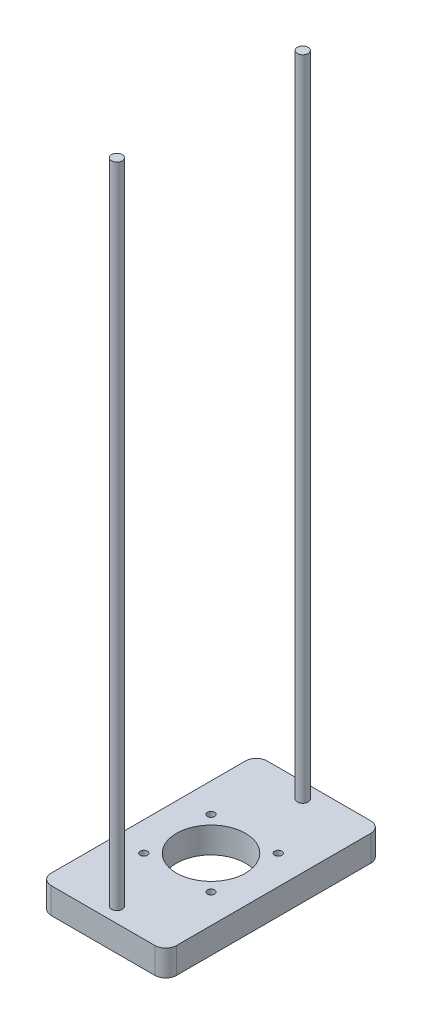
ISO-10303-21;
HEADER;
FILE_DESCRIPTION(('STEP AP214'),'2;1');
FILE_NAME('part.step','',(''),(''),'','','');
FILE_SCHEMA(('AUTOMOTIVE_DESIGN { 1 0 10303 214 1 1 1 1 }'));
ENDSEC;
DATA;
#1=APPLICATION_CONTEXT('core data for automotive mechanical design processes');
#2=APPLICATION_PROTOCOL_DEFINITION('international standard','automotive_design',2000,#1);
#3=PRODUCT_CONTEXT('',#1,'mechanical');
#4=PRODUCT('Part','Part','',(#3));
#5=PRODUCT_RELATED_PRODUCT_CATEGORY('part','',(#4));
#6=PRODUCT_DEFINITION_FORMATION('','',#4);
#7=PRODUCT_DEFINITION_CONTEXT('part definition',#1,'design');
#8=PRODUCT_DEFINITION('design','',#6,#7);
#9=PRODUCT_DEFINITION_SHAPE('','',#8);
#10=(LENGTH_UNIT() NAMED_UNIT(*) SI_UNIT(.MILLI.,.METRE.));
#11=(NAMED_UNIT(*) PLANE_ANGLE_UNIT() SI_UNIT($,.RADIAN.));
#12=(NAMED_UNIT(*) SI_UNIT($,.STERADIAN.) SOLID_ANGLE_UNIT());
#13=UNCERTAINTY_MEASURE_WITH_UNIT(LENGTH_MEASURE(1.E-05),#10,'distance_accuracy_value','');
#14=(GEOMETRIC_REPRESENTATION_CONTEXT(3) GLOBAL_UNCERTAINTY_ASSIGNED_CONTEXT((#13)) GLOBAL_UNIT_ASSIGNED_CONTEXT((#10,
#11,#12)) REPRESENTATION_CONTEXT('',''));
#15=CARTESIAN_POINT('',(0.,0.,0.));
#16=DIRECTION('',(0.,0.,1.));
#17=DIRECTION('',(1.,0.,0.));
#18=AXIS2_PLACEMENT_3D('',#15,#16,#17);
#19=CARTESIAN_POINT('',(29.246062992126,21.,-61.3135876064418));
#20=DIRECTION('',(0.,-1.,0.));
#21=DIRECTION('',(0.,0.,-1.));
#22=AXIS2_PLACEMENT_3D('',#19,#20,#21);
#23=PLANE('',#22);
#24=CARTESIAN_POINT('',(4.7046178470314,21.,26.6530870575681));
#25=DIRECTION('',(0.,-1.,0.));
#26=DIRECTION('',(0.,0.,-1.));
#27=AXIS2_PLACEMENT_3D('',#24,#25,#26);
#28=CIRCLE('',#27,2.5);
#29=CARTESIAN_POINT('',(4.7046178470314,21.,24.1530870575681));
#30=VERTEX_POINT('',#29);
#31=EDGE_CURVE('E11',#30,#30,#28,.F.);
#32=ORIENTED_EDGE('',*,*,#31,.F.);
#33=EDGE_LOOP('',(#32));
#34=FACE_BOUND('',#33,.T.);
#35=CARTESIAN_POINT('',(4.69617178425094,21.,-59.3399877427739));
#36=DIRECTION('',(0.,-1.,0.));
#37=DIRECTION('',(0.,0.,-1.));
#38=AXIS2_PLACEMENT_3D('',#35,#36,#37);
#39=CIRCLE('',#38,2.5);
#40=CARTESIAN_POINT('',(4.69617178425094,21.,-61.8399877427739));
#41=VERTEX_POINT('',#40);
#42=EDGE_CURVE('E45',#41,#41,#39,.F.);
#43=ORIENTED_EDGE('',*,*,#42,.F.);
#44=EDGE_LOOP('',(#43));
#45=FACE_BOUND('',#44,.T.);
#46=CARTESIAN_POINT('',(-10.3102861939768,21.,-0.78715475090257));
#47=DIRECTION('',(0.,1.,0.));
#48=DIRECTION('',(0.,0.,1.));
#49=AXIS2_PLACEMENT_3D('',#46,#47,#48);
#50=CIRCLE('',#49,1.7);
#51=CARTESIAN_POINT('',(-10.3102861939768,21.,0.912845249097429));
#52=VERTEX_POINT('',#51);
#53=EDGE_CURVE('E168',#52,#52,#50,.T.);
#54=ORIENTED_EDGE('',*,*,#53,.F.);
#55=EDGE_LOOP('',(#54));
#56=FACE_BOUND('',#55,.T.);
#57=CARTESIAN_POINT('',(-10.3102861939768,21.,-31.8998531231132));
#58=DIRECTION('',(0.,1.,0.));
#59=DIRECTION('',(0.,0.,1.));
#60=AXIS2_PLACEMENT_3D('',#57,#58,#59);
#61=CIRCLE('',#60,1.7);
#62=CARTESIAN_POINT('',(-10.3102861939768,21.,-30.1998531231132));
#63=VERTEX_POINT('',#62);
#64=EDGE_CURVE('E193',#63,#63,#61,.T.);
#65=ORIENTED_EDGE('',*,*,#64,.F.);
#66=EDGE_LOOP('',(#65));
#67=FACE_BOUND('',#66,.T.);
#68=CARTESIAN_POINT('',(20.8024121782313,21.,-31.8998531231106));
#69=DIRECTION('',(0.,1.,0.));
#70=DIRECTION('',(0.,0.,1.));
#71=AXIS2_PLACEMENT_3D('',#68,#69,#70);
#72=CIRCLE('',#71,1.7);
#73=CARTESIAN_POINT('',(20.8024121782313,21.,-30.1998531231106));
#74=VERTEX_POINT('',#73);
#75=EDGE_CURVE('E197',#74,#74,#72,.T.);
#76=ORIENTED_EDGE('',*,*,#75,.F.);
#77=EDGE_LOOP('',(#76));
#78=FACE_BOUND('',#77,.T.);
#79=CARTESIAN_POINT('',(20.8024121782313,21.,-0.787154750905122));
#80=DIRECTION('',(0.,1.,0.));
#81=DIRECTION('',(0.,0.,1.));
#82=AXIS2_PLACEMENT_3D('',#79,#80,#81);
#83=CIRCLE('',#82,1.7);
#84=CARTESIAN_POINT('',(20.8024121782313,21.,0.912845249094878));
#85=VERTEX_POINT('',#84);
#86=EDGE_CURVE('E200',#85,#85,#83,.T.);
#87=ORIENTED_EDGE('',*,*,#86,.F.);
#88=EDGE_LOOP('',(#87));
#89=FACE_BOUND('',#88,.T.);
#90=CARTESIAN_POINT('',(29.246062992126,21.,-61.3135876064418));
#91=DIRECTION('',(0.,1.,0.));
#92=DIRECTION('',(0.,0.,-1.));
#93=AXIS2_PLACEMENT_3D('',#90,#91,#92);
#94=CIRCLE('',#93,5.);
#95=CARTESIAN_POINT('',(34.246062992126,21.,-61.3135876064418));
#96=VERTEX_POINT('',#95);
#97=CARTESIAN_POINT('',(29.2460629921259,21.,-66.3135876064418));
#98=VERTEX_POINT('',#97);
#99=EDGE_CURVE('E149',#96,#98,#94,.T.);
#100=ORIENTED_EDGE('',*,*,#99,.T.);
#101=DIRECTION('',(-1.,0.,0.));
#102=VECTOR('',#101,1.);
#103=CARTESIAN_POINT('',(-18.753937007874,21.,-66.3135876064418));
#104=LINE('',#103,#102);
#105=CARTESIAN_POINT('',(-18.753937007874,21.,-66.3135876064418));
#106=VERTEX_POINT('',#105);
#107=EDGE_CURVE('E97',#98,#106,#104,.T.);
#108=ORIENTED_EDGE('',*,*,#107,.T.);
#109=CARTESIAN_POINT('',(-18.753937007874,21.,-61.3135876064418));
#110=DIRECTION('',(0.,1.,0.));
#111=DIRECTION('',(0.,0.,-1.));
#112=AXIS2_PLACEMENT_3D('',#109,#110,#111);
#113=CIRCLE('',#112,5.);
#114=CARTESIAN_POINT('',(-23.753937007874,21.,-61.3135876064418));
#115=VERTEX_POINT('',#114);
#116=EDGE_CURVE('E216',#106,#115,#113,.T.);
#117=ORIENTED_EDGE('',*,*,#116,.T.);
#118=DIRECTION('',(0.,0.,1.));
#119=VECTOR('',#118,1.);
#120=CARTESIAN_POINT('',(-23.753937007874,21.,28.626579732426));
#121=LINE('',#120,#119);
#122=CARTESIAN_POINT('',(-23.753937007874,21.,28.626579732426));
#123=VERTEX_POINT('',#122);
#124=EDGE_CURVE('E218',#115,#123,#121,.T.);
#125=ORIENTED_EDGE('',*,*,#124,.T.);
#126=CARTESIAN_POINT('',(-18.753937007874,21.,28.626579732426));
#127=DIRECTION('',(0.,1.,0.));
#128=DIRECTION('',(0.,0.,-1.));
#129=AXIS2_PLACEMENT_3D('',#126,#127,#128);
#130=CIRCLE('',#129,5.);
#131=CARTESIAN_POINT('',(-18.753937007874,21.,33.626579732426));
#132=VERTEX_POINT('',#131);
#133=EDGE_CURVE('E116',#123,#132,#130,.T.);
#134=ORIENTED_EDGE('',*,*,#133,.T.);
#135=DIRECTION('',(1.,0.,0.));
#136=VECTOR('',#135,1.);
#137=CARTESIAN_POINT('',(-18.753937007874,21.,33.626579732426));
#138=LINE('',#137,#136);
#139=CARTESIAN_POINT('',(29.2460629921259,21.,33.626579732426));
#140=VERTEX_POINT('',#139);
#141=EDGE_CURVE('E110',#132,#140,#138,.T.);
#142=ORIENTED_EDGE('',*,*,#141,.T.);
#143=CARTESIAN_POINT('',(29.246062992126,21.,28.626579732426));
#144=DIRECTION('',(0.,1.,0.));
#145=DIRECTION('',(0.,0.,1.));
#146=AXIS2_PLACEMENT_3D('',#143,#144,#145);
#147=CIRCLE('',#146,5.);
#148=CARTESIAN_POINT('',(34.246062992126,21.,28.626579732426));
#149=VERTEX_POINT('',#148);
#150=EDGE_CURVE('E114',#140,#149,#147,.T.);
#151=ORIENTED_EDGE('',*,*,#150,.T.);
#152=DIRECTION('',(0.,0.,-1.));
#153=VECTOR('',#152,1.);
#154=CARTESIAN_POINT('',(34.246062992126,21.,28.626579732426));
#155=LINE('',#154,#153);
#156=EDGE_CURVE('E53',#149,#96,#155,.T.);
#157=ORIENTED_EDGE('',*,*,#156,.T.);
#158=EDGE_LOOP('',(#100,#108,#117,#125,#134,#142,#151,#157));
#159=FACE_BOUND('',#158,.T.);
#160=CARTESIAN_POINT('',(5.24606299212598,21.,-16.3435039370079));
#161=DIRECTION('',(0.,1.,0.));
#162=DIRECTION('',(0.,0.,1.));
#163=AXIS2_PLACEMENT_3D('',#160,#161,#162);
#164=CIRCLE('',#163,15.975);
#165=CARTESIAN_POINT('',(5.24606299212598,21.,-0.36850393700787));
#166=VERTEX_POINT('',#165);
#167=EDGE_CURVE('E138',#166,#166,#164,.T.);
#168=ORIENTED_EDGE('',*,*,#167,.F.);
#169=EDGE_LOOP('',(#168));
#170=FACE_BOUND('',#169,.T.);
#171=ADVANCED_FACE('F36',(#34,#45,#56,#67,#78,#89,#159,#170),#23,.F.);
#172=CARTESIAN_POINT('',(29.246062992126,8.99999999999999,-61.3135876064418));
#173=DIRECTION('',(0.,-1.,0.));
#174=DIRECTION('',(0.,0.,-1.));
#175=AXIS2_PLACEMENT_3D('',#172,#173,#174);
#176=PLANE('',#175);
#177=CARTESIAN_POINT('',(4.7046178470314,8.99999999999999,26.6530870575681));
#178=DIRECTION('',(0.,1.,0.));
#179=DIRECTION('',(0.,0.,1.));
#180=AXIS2_PLACEMENT_3D('',#177,#178,#179);
#181=CIRCLE('',#180,1.89865);
#182=CARTESIAN_POINT('',(4.7046178470314,8.99999999999999,28.5517370575681));
#183=VERTEX_POINT('',#182);
#184=EDGE_CURVE('E206',#183,#183,#181,.T.);
#185=ORIENTED_EDGE('',*,*,#184,.T.);
#186=EDGE_LOOP('',(#185));
#187=FACE_BOUND('',#186,.T.);
#188=CARTESIAN_POINT('',(4.69617178425094,8.99999999999999,-59.3399877427739));
#189=DIRECTION('',(0.,1.,0.));
#190=DIRECTION('',(0.,0.,1.));
#191=AXIS2_PLACEMENT_3D('',#188,#189,#190);
#192=CIRCLE('',#191,1.89865);
#193=CARTESIAN_POINT('',(4.69617178425094,8.99999999999999,-57.4413377427739));
#194=VERTEX_POINT('',#193);
#195=EDGE_CURVE('E202',#194,#194,#192,.T.);
#196=ORIENTED_EDGE('',*,*,#195,.T.);
#197=EDGE_LOOP('',(#196));
#198=FACE_BOUND('',#197,.T.);
#199=CARTESIAN_POINT('',(-10.3102861939768,8.99999999999999,-0.78715475090257));
#200=DIRECTION('',(0.,-1.,0.));
#201=DIRECTION('',(0.,0.,-1.));
#202=AXIS2_PLACEMENT_3D('',#199,#200,#201);
#203=CIRCLE('',#202,1.7);
#204=CARTESIAN_POINT('',(-10.3102861939768,8.99999999999999,-2.48715475090257));
#205=VERTEX_POINT('',#204);
#206=EDGE_CURVE('E174',#205,#205,#203,.T.);
#207=ORIENTED_EDGE('',*,*,#206,.F.);
#208=EDGE_LOOP('',(#207));
#209=FACE_BOUND('',#208,.T.);
#210=CARTESIAN_POINT('',(-10.3102861939768,8.99999999999999,-31.8998531231132));
#211=DIRECTION('',(0.,-1.,0.));
#212=DIRECTION('',(0.,0.,-1.));
#213=AXIS2_PLACEMENT_3D('',#210,#211,#212);
#214=CIRCLE('',#213,1.7);
#215=CARTESIAN_POINT('',(-10.3102861939768,8.99999999999999,-33.5998531231132));
#216=VERTEX_POINT('',#215);
#217=EDGE_CURVE('E171',#216,#216,#214,.T.);
#218=ORIENTED_EDGE('',*,*,#217,.F.);
#219=EDGE_LOOP('',(#218));
#220=FACE_BOUND('',#219,.T.);
#221=CARTESIAN_POINT('',(20.8024121782313,8.99999999999999,-31.8998531231106));
#222=DIRECTION('',(0.,-1.,0.));
#223=DIRECTION('',(0.,0.,-1.));
#224=AXIS2_PLACEMENT_3D('',#221,#222,#223);
#225=CIRCLE('',#224,1.7);
#226=CARTESIAN_POINT('',(20.8024121782313,8.99999999999999,-33.5998531231106));
#227=VERTEX_POINT('',#226);
#228=EDGE_CURVE('E167',#227,#227,#225,.T.);
#229=ORIENTED_EDGE('',*,*,#228,.F.);
#230=EDGE_LOOP('',(#229));
#231=FACE_BOUND('',#230,.T.);
#232=CARTESIAN_POINT('',(20.8024121782313,8.99999999999999,-0.787154750905122));
#233=DIRECTION('',(0.,-1.,0.));
#234=DIRECTION('',(0.,0.,-1.));
#235=AXIS2_PLACEMENT_3D('',#232,#233,#234);
#236=CIRCLE('',#235,1.7);
#237=CARTESIAN_POINT('',(20.8024121782313,8.99999999999999,-2.48715475090512));
#238=VERTEX_POINT('',#237);
#239=EDGE_CURVE('E164',#238,#238,#236,.T.);
#240=ORIENTED_EDGE('',*,*,#239,.F.);
#241=EDGE_LOOP('',(#240));
#242=FACE_BOUND('',#241,.T.);
#243=CARTESIAN_POINT('',(29.246062992126,8.99999999999999,-61.3135876064418));
#244=DIRECTION('',(0.,1.,0.));
#245=DIRECTION('',(0.,0.,-1.));
#246=AXIS2_PLACEMENT_3D('',#243,#244,#245);
#247=CIRCLE('',#246,5.);
#248=CARTESIAN_POINT('',(34.246062992126,8.99999999999999,-61.3135876064418));
#249=VERTEX_POINT('',#248);
#250=CARTESIAN_POINT('',(29.2460629921259,8.99999999999999,-66.3135876064418));
#251=VERTEX_POINT('',#250);
#252=EDGE_CURVE('E134',#249,#251,#247,.T.);
#253=ORIENTED_EDGE('',*,*,#252,.F.);
#254=DIRECTION('',(0.,0.,-1.));
#255=VECTOR('',#254,1.);
#256=CARTESIAN_POINT('',(34.246062992126,8.99999999999999,28.626579732426));
#257=LINE('',#256,#255);
#258=CARTESIAN_POINT('',(34.246062992126,8.99999999999999,28.626579732426));
#259=VERTEX_POINT('',#258);
#260=EDGE_CURVE('E88',#259,#249,#257,.T.);
#261=ORIENTED_EDGE('',*,*,#260,.F.);
#262=CARTESIAN_POINT('',(29.246062992126,8.99999999999999,28.626579732426));
#263=DIRECTION('',(0.,1.,0.));
#264=DIRECTION('',(0.,0.,1.));
#265=AXIS2_PLACEMENT_3D('',#262,#263,#264);
#266=CIRCLE('',#265,5.);
#267=CARTESIAN_POINT('',(29.2460629921259,8.99999999999999,33.626579732426));
#268=VERTEX_POINT('',#267);
#269=EDGE_CURVE('E82',#268,#259,#266,.T.);
#270=ORIENTED_EDGE('',*,*,#269,.F.);
#271=DIRECTION('',(1.,0.,0.));
#272=VECTOR('',#271,1.);
#273=CARTESIAN_POINT('',(-18.753937007874,8.99999999999999,33.626579732426));
#274=LINE('',#273,#272);
#275=CARTESIAN_POINT('',(-18.753937007874,8.99999999999999,33.626579732426));
#276=VERTEX_POINT('',#275);
#277=EDGE_CURVE('E124',#276,#268,#274,.T.);
#278=ORIENTED_EDGE('',*,*,#277,.F.);
#279=CARTESIAN_POINT('',(-18.753937007874,8.99999999999999,28.626579732426));
#280=DIRECTION('',(0.,1.,0.));
#281=DIRECTION('',(0.,0.,-1.));
#282=AXIS2_PLACEMENT_3D('',#279,#280,#281);
#283=CIRCLE('',#282,5.);
#284=CARTESIAN_POINT('',(-23.753937007874,8.99999999999999,28.626579732426));
#285=VERTEX_POINT('',#284);
#286=EDGE_CURVE('E144',#285,#276,#283,.T.);
#287=ORIENTED_EDGE('',*,*,#286,.F.);
#288=DIRECTION('',(0.,0.,1.));
#289=VECTOR('',#288,1.);
#290=CARTESIAN_POINT('',(-23.753937007874,8.99999999999999,28.626579732426));
#291=LINE('',#290,#289);
#292=CARTESIAN_POINT('',(-23.753937007874,8.99999999999999,-61.3135876064418));
#293=VERTEX_POINT('',#292);
#294=EDGE_CURVE('E142',#293,#285,#291,.T.);
#295=ORIENTED_EDGE('',*,*,#294,.F.);
#296=CARTESIAN_POINT('',(-18.753937007874,8.99999999999999,-61.3135876064418));
#297=DIRECTION('',(0.,1.,0.));
#298=DIRECTION('',(0.,0.,-1.));
#299=AXIS2_PLACEMENT_3D('',#296,#297,#298);
#300=CIRCLE('',#299,5.);
#301=CARTESIAN_POINT('',(-18.753937007874,8.99999999999999,-66.3135876064418));
#302=VERTEX_POINT('',#301);
#303=EDGE_CURVE('E140',#302,#293,#300,.T.);
#304=ORIENTED_EDGE('',*,*,#303,.F.);
#305=DIRECTION('',(-1.,0.,0.));
#306=VECTOR('',#305,1.);
#307=CARTESIAN_POINT('',(-18.753937007874,8.99999999999999,-66.3135876064418));
#308=LINE('',#307,#306);
#309=EDGE_CURVE('E137',#251,#302,#308,.T.);
#310=ORIENTED_EDGE('',*,*,#309,.F.);
#311=EDGE_LOOP('',(#253,#261,#270,#278,#287,#295,#304,#310));
#312=FACE_BOUND('',#311,.T.);
#313=CARTESIAN_POINT('',(5.24606299212598,8.99999999999999,-16.3435039370079));
#314=DIRECTION('',(0.,1.,0.));
#315=DIRECTION('',(0.,0.,1.));
#316=AXIS2_PLACEMENT_3D('',#313,#314,#315);
#317=CIRCLE('',#316,15.975);
#318=CARTESIAN_POINT('',(5.24606299212598,8.99999999999999,-0.36850393700787));
#319=VERTEX_POINT('',#318);
#320=EDGE_CURVE('E176',#319,#319,#317,.T.);
#321=ORIENTED_EDGE('',*,*,#320,.T.);
#322=EDGE_LOOP('',(#321));
#323=FACE_BOUND('',#322,.T.);
#324=ADVANCED_FACE('F184',(#187,#198,#209,#220,#231,#242,#312,#323),#176,.T.);
#325=CARTESIAN_POINT('',(29.246062992126,21.,-61.3135876064418));
#326=DIRECTION('',(0.,-1.,0.));
#327=DIRECTION('',(0.,0.,-1.));
#328=AXIS2_PLACEMENT_3D('',#325,#326,#327);
#329=CYLINDRICAL_SURFACE('',#328,5.);
#330=ORIENTED_EDGE('',*,*,#252,.T.);
#331=DIRECTION('',(0.,-1.,0.));
#332=VECTOR('',#331,1.);
#333=CARTESIAN_POINT('',(29.2460629921259,21.,-66.3135876064418));
#334=LINE('',#333,#332);
#335=EDGE_CURVE('E162',#98,#251,#334,.T.);
#336=ORIENTED_EDGE('',*,*,#335,.F.);
#337=ORIENTED_EDGE('',*,*,#99,.F.);
#338=DIRECTION('',(0.,-1.,0.));
#339=VECTOR('',#338,1.);
#340=CARTESIAN_POINT('',(34.246062992126,21.,-61.3135876064418));
#341=LINE('',#340,#339);
#342=EDGE_CURVE('E130',#96,#249,#341,.T.);
#343=ORIENTED_EDGE('',*,*,#342,.T.);
#344=EDGE_LOOP('',(#330,#336,#337,#343));
#345=FACE_BOUND('',#344,.T.);
#346=ADVANCED_FACE('F38',(#345),#329,.T.);
#347=CARTESIAN_POINT('',(-18.753937007874,21.,-66.3135876064418));
#348=DIRECTION('',(0.,0.,1.));
#349=DIRECTION('',(1.,0.,0.));
#350=AXIS2_PLACEMENT_3D('',#347,#348,#349);
#351=PLANE('',#350);
#352=ORIENTED_EDGE('',*,*,#309,.T.);
#353=DIRECTION('',(0.,-1.,0.));
#354=VECTOR('',#353,1.);
#355=CARTESIAN_POINT('',(-18.753937007874,21.,-66.3135876064418));
#356=LINE('',#355,#354);
#357=EDGE_CURVE('E159',#106,#302,#356,.T.);
#358=ORIENTED_EDGE('',*,*,#357,.F.);
#359=ORIENTED_EDGE('',*,*,#107,.F.);
#360=ORIENTED_EDGE('',*,*,#335,.T.);
#361=EDGE_LOOP('',(#352,#358,#359,#360));
#362=FACE_BOUND('',#361,.T.);
#363=ADVANCED_FACE('F258',(#362),#351,.F.);
#364=CARTESIAN_POINT('',(-18.753937007874,21.,-61.3135876064418));
#365=DIRECTION('',(0.,-1.,0.));
#366=DIRECTION('',(0.,0.,-1.));
#367=AXIS2_PLACEMENT_3D('',#364,#365,#366);
#368=CYLINDRICAL_SURFACE('',#367,5.);
#369=ORIENTED_EDGE('',*,*,#303,.T.);
#370=DIRECTION('',(0.,-1.,0.));
#371=VECTOR('',#370,1.);
#372=CARTESIAN_POINT('',(-23.753937007874,21.,-61.3135876064418));
#373=LINE('',#372,#371);
#374=EDGE_CURVE('E156',#115,#293,#373,.T.);
#375=ORIENTED_EDGE('',*,*,#374,.F.);
#376=ORIENTED_EDGE('',*,*,#116,.F.);
#377=ORIENTED_EDGE('',*,*,#357,.T.);
#378=EDGE_LOOP('',(#369,#375,#376,#377));
#379=FACE_BOUND('',#378,.T.);
#380=ADVANCED_FACE('F256',(#379),#368,.T.);
#381=CARTESIAN_POINT('',(-23.753937007874,21.,28.626579732426));
#382=DIRECTION('',(1.,0.,0.));
#383=DIRECTION('',(0.,0.,-1.));
#384=AXIS2_PLACEMENT_3D('',#381,#382,#383);
#385=PLANE('',#384);
#386=ORIENTED_EDGE('',*,*,#294,.T.);
#387=DIRECTION('',(0.,-1.,0.));
#388=VECTOR('',#387,1.);
#389=CARTESIAN_POINT('',(-23.753937007874,21.,28.626579732426));
#390=LINE('',#389,#388);
#391=EDGE_CURVE('E153',#123,#285,#390,.T.);
#392=ORIENTED_EDGE('',*,*,#391,.F.);
#393=ORIENTED_EDGE('',*,*,#124,.F.);
#394=ORIENTED_EDGE('',*,*,#374,.T.);
#395=EDGE_LOOP('',(#386,#392,#393,#394));
#396=FACE_BOUND('',#395,.T.);
#397=ADVANCED_FACE('F224',(#396),#385,.F.);
#398=CARTESIAN_POINT('',(-18.753937007874,21.,28.626579732426));
#399=DIRECTION('',(0.,-1.,0.));
#400=DIRECTION('',(0.,0.,-1.));
#401=AXIS2_PLACEMENT_3D('',#398,#399,#400);
#402=CYLINDRICAL_SURFACE('',#401,5.);
#403=ORIENTED_EDGE('',*,*,#286,.T.);
#404=DIRECTION('',(0.,-1.,0.));
#405=VECTOR('',#404,1.);
#406=CARTESIAN_POINT('',(-18.753937007874,21.,33.626579732426));
#407=LINE('',#406,#405);
#408=EDGE_CURVE('E125',#132,#276,#407,.T.);
#409=ORIENTED_EDGE('',*,*,#408,.F.);
#410=ORIENTED_EDGE('',*,*,#133,.F.);
#411=ORIENTED_EDGE('',*,*,#391,.T.);
#412=EDGE_LOOP('',(#403,#409,#410,#411));
#413=FACE_BOUND('',#412,.T.);
#414=ADVANCED_FACE('F228',(#413),#402,.T.);
#415=CARTESIAN_POINT('',(-18.753937007874,21.,33.626579732426));
#416=DIRECTION('',(0.,0.,-1.));
#417=DIRECTION('',(-1.,0.,0.));
#418=AXIS2_PLACEMENT_3D('',#415,#416,#417);
#419=PLANE('',#418);
#420=ORIENTED_EDGE('',*,*,#277,.T.);
#421=DIRECTION('',(0.,-1.,0.));
#422=VECTOR('',#421,1.);
#423=CARTESIAN_POINT('',(29.2460629921259,21.,33.626579732426));
#424=LINE('',#423,#422);
#425=EDGE_CURVE('E121',#140,#268,#424,.T.);
#426=ORIENTED_EDGE('',*,*,#425,.F.);
#427=ORIENTED_EDGE('',*,*,#141,.F.);
#428=ORIENTED_EDGE('',*,*,#408,.T.);
#429=EDGE_LOOP('',(#420,#426,#427,#428));
#430=FACE_BOUND('',#429,.T.);
#431=ADVANCED_FACE('F122',(#430),#419,.F.);
#432=CARTESIAN_POINT('',(29.246062992126,21.,28.626579732426));
#433=DIRECTION('',(0.,-1.,0.));
#434=DIRECTION('',(0.,0.,-1.));
#435=AXIS2_PLACEMENT_3D('',#432,#433,#434);
#436=CYLINDRICAL_SURFACE('',#435,5.);
#437=ORIENTED_EDGE('',*,*,#269,.T.);
#438=DIRECTION('',(0.,-1.,0.));
#439=VECTOR('',#438,1.);
#440=CARTESIAN_POINT('',(34.246062992126,21.,28.626579732426));
#441=LINE('',#440,#439);
#442=EDGE_CURVE('E126',#149,#259,#441,.T.);
#443=ORIENTED_EDGE('',*,*,#442,.F.);
#444=ORIENTED_EDGE('',*,*,#150,.F.);
#445=ORIENTED_EDGE('',*,*,#425,.T.);
#446=EDGE_LOOP('',(#437,#443,#444,#445));
#447=FACE_BOUND('',#446,.T.);
#448=ADVANCED_FACE('F128',(#447),#436,.T.);
#449=CARTESIAN_POINT('',(34.246062992126,21.,28.626579732426));
#450=DIRECTION('',(-1.,0.,0.));
#451=DIRECTION('',(0.,0.,1.));
#452=AXIS2_PLACEMENT_3D('',#449,#450,#451);
#453=PLANE('',#452);
#454=ORIENTED_EDGE('',*,*,#260,.T.);
#455=ORIENTED_EDGE('',*,*,#342,.F.);
#456=ORIENTED_EDGE('',*,*,#156,.F.);
#457=ORIENTED_EDGE('',*,*,#442,.T.);
#458=EDGE_LOOP('',(#454,#455,#456,#457));
#459=FACE_BOUND('',#458,.T.);
#460=ADVANCED_FACE('F236',(#459),#453,.F.);
#461=CARTESIAN_POINT('',(5.24606299212598,21.,-16.3435039370079));
#462=DIRECTION('',(0.,-1.,0.));
#463=DIRECTION('',(0.,0.,-1.));
#464=AXIS2_PLACEMENT_3D('',#461,#462,#463);
#465=CYLINDRICAL_SURFACE('',#464,15.975);
#466=ORIENTED_EDGE('',*,*,#167,.T.);
#467=EDGE_LOOP('',(#466));
#468=FACE_BOUND('',#467,.T.);
#469=ORIENTED_EDGE('',*,*,#320,.F.);
#470=EDGE_LOOP('',(#469));
#471=FACE_BOUND('',#470,.T.);
#472=ADVANCED_FACE('F238',(#468,#471),#465,.F.);
#473=CARTESIAN_POINT('',(20.8024121782313,-3.15376492644493,-0.787154750905122));
#474=DIRECTION('',(0.,1.,0.));
#475=DIRECTION('',(0.,0.,1.));
#476=AXIS2_PLACEMENT_3D('',#473,#474,#475);
#477=CYLINDRICAL_SURFACE('',#476,1.7);
#478=ORIENTED_EDGE('',*,*,#239,.T.);
#479=EDGE_LOOP('',(#478));
#480=FACE_BOUND('',#479,.T.);
#481=ORIENTED_EDGE('',*,*,#86,.T.);
#482=EDGE_LOOP('',(#481));
#483=FACE_BOUND('',#482,.T.);
#484=ADVANCED_FACE('F244',(#480,#483),#477,.F.);
#485=CARTESIAN_POINT('',(20.8024121782313,-3.15376492644493,-31.8998531231106));
#486=DIRECTION('',(0.,1.,0.));
#487=DIRECTION('',(0.,0.,1.));
#488=AXIS2_PLACEMENT_3D('',#485,#486,#487);
#489=CYLINDRICAL_SURFACE('',#488,1.7);
#490=ORIENTED_EDGE('',*,*,#228,.T.);
#491=EDGE_LOOP('',(#490));
#492=FACE_BOUND('',#491,.T.);
#493=ORIENTED_EDGE('',*,*,#75,.T.);
#494=EDGE_LOOP('',(#493));
#495=FACE_BOUND('',#494,.T.);
#496=ADVANCED_FACE('F284',(#492,#495),#489,.F.);
#497=CARTESIAN_POINT('',(-10.3102861939768,-3.15376492644493,-31.8998531231132));
#498=DIRECTION('',(0.,1.,0.));
#499=DIRECTION('',(0.,0.,1.));
#500=AXIS2_PLACEMENT_3D('',#497,#498,#499);
#501=CYLINDRICAL_SURFACE('',#500,1.7);
#502=ORIENTED_EDGE('',*,*,#217,.T.);
#503=EDGE_LOOP('',(#502));
#504=FACE_BOUND('',#503,.T.);
#505=ORIENTED_EDGE('',*,*,#64,.T.);
#506=EDGE_LOOP('',(#505));
#507=FACE_BOUND('',#506,.T.);
#508=ADVANCED_FACE('F289',(#504,#507),#501,.F.);
#509=CARTESIAN_POINT('',(-10.3102861939768,-3.15376492644493,-0.78715475090257));
#510=DIRECTION('',(0.,1.,0.));
#511=DIRECTION('',(0.,0.,1.));
#512=AXIS2_PLACEMENT_3D('',#509,#510,#511);
#513=CYLINDRICAL_SURFACE('',#512,1.7);
#514=ORIENTED_EDGE('',*,*,#206,.T.);
#515=EDGE_LOOP('',(#514));
#516=FACE_BOUND('',#515,.T.);
#517=ORIENTED_EDGE('',*,*,#53,.T.);
#518=EDGE_LOOP('',(#517));
#519=FACE_BOUND('',#518,.T.);
#520=ADVANCED_FACE('F295',(#516,#519),#513,.F.);
#521=CARTESIAN_POINT('',(4.69617178425094,21.,-59.3399877427739));
#522=DIRECTION('',(0.,1.,0.));
#523=DIRECTION('',(0.,0.,1.));
#524=AXIS2_PLACEMENT_3D('',#521,#522,#523);
#525=CYLINDRICAL_SURFACE('',#524,1.89864999999999);
#526=ORIENTED_EDGE('',*,*,#195,.F.);
#527=EDGE_LOOP('',(#526));
#528=FACE_BOUND('',#527,.T.);
#529=CARTESIAN_POINT('',(4.69617178425094,21.,-59.3399877427739));
#530=DIRECTION('',(0.,1.,0.));
#531=DIRECTION('',(0.,0.,1.));
#532=AXIS2_PLACEMENT_3D('',#529,#530,#531);
#533=CIRCLE('',#532,1.89864999999999);
#534=CARTESIAN_POINT('',(4.69617178425094,21.,-57.4413377427739));
#535=VERTEX_POINT('',#534);
#536=EDGE_CURVE('E343',#535,#535,#533,.F.);
#537=ORIENTED_EDGE('',*,*,#536,.F.);
#538=EDGE_LOOP('',(#537));
#539=FACE_BOUND('',#538,.T.);
#540=ADVANCED_FACE('F299',(#528,#539),#525,.F.);
#541=CARTESIAN_POINT('',(4.7046178470314,21.,26.6530870575681));
#542=DIRECTION('',(0.,1.,0.));
#543=DIRECTION('',(0.,0.,1.));
#544=AXIS2_PLACEMENT_3D('',#541,#542,#543);
#545=CYLINDRICAL_SURFACE('',#544,1.89864999999999);
#546=ORIENTED_EDGE('',*,*,#184,.F.);
#547=EDGE_LOOP('',(#546));
#548=FACE_BOUND('',#547,.T.);
#549=CARTESIAN_POINT('',(4.7046178470314,21.,26.6530870575681));
#550=DIRECTION('',(0.,1.,0.));
#551=DIRECTION('',(0.,0.,1.));
#552=AXIS2_PLACEMENT_3D('',#549,#550,#551);
#553=CIRCLE('',#552,1.89864999999999);
#554=CARTESIAN_POINT('',(4.7046178470314,21.,28.5517370575681));
#555=VERTEX_POINT('',#554);
#556=EDGE_CURVE('E335',#555,#555,#553,.F.);
#557=ORIENTED_EDGE('',*,*,#556,.F.);
#558=EDGE_LOOP('',(#557));
#559=FACE_BOUND('',#558,.T.);
#560=ADVANCED_FACE('F303',(#548,#559),#545,.F.);
#561=CARTESIAN_POINT('',(4.69617178425094,21.,-59.3399877427739));
#562=DIRECTION('',(0.,1.,0.));
#563=DIRECTION('',(0.,0.,1.));
#564=AXIS2_PLACEMENT_3D('',#561,#562,#563);
#565=PLANE('',#564);
#566=ORIENTED_EDGE('',*,*,#536,.T.);
#567=EDGE_LOOP('',(#566));
#568=FACE_BOUND('',#567,.T.);
#569=ADVANCED_FACE('F307',(#568),#565,.F.);
#570=CARTESIAN_POINT('',(4.69617178425094,321.,-59.3399877427739));
#571=DIRECTION('',(0.,-1.,0.));
#572=DIRECTION('',(0.,0.,-1.));
#573=AXIS2_PLACEMENT_3D('',#570,#571,#572);
#574=CYLINDRICAL_SURFACE('',#573,2.5);
#575=CARTESIAN_POINT('',(4.69617178425094,321.,-59.3399877427739));
#576=DIRECTION('',(0.,1.,0.));
#577=DIRECTION('',(0.,0.,1.));
#578=AXIS2_PLACEMENT_3D('',#575,#576,#577);
#579=CIRCLE('',#578,2.5);
#580=CARTESIAN_POINT('',(4.69617178425094,321.,-56.8399877427739));
#581=VERTEX_POINT('',#580);
#582=EDGE_CURVE('E338',#581,#581,#579,.T.);
#583=ORIENTED_EDGE('',*,*,#582,.F.);
#584=EDGE_LOOP('',(#583));
#585=FACE_BOUND('',#584,.T.);
#586=ORIENTED_EDGE('',*,*,#42,.T.);
#587=EDGE_LOOP('',(#586));
#588=FACE_BOUND('',#587,.T.);
#589=ADVANCED_FACE('F180',(#585,#588),#574,.T.);
#590=CARTESIAN_POINT('',(4.69617178425094,321.,-59.3399877427739));
#591=DIRECTION('',(0.,1.,0.));
#592=DIRECTION('',(0.,0.,1.));
#593=AXIS2_PLACEMENT_3D('',#590,#591,#592);
#594=PLANE('',#593);
#595=ORIENTED_EDGE('',*,*,#582,.T.);
#596=EDGE_LOOP('',(#595));
#597=FACE_BOUND('',#596,.T.);
#598=ADVANCED_FACE('F311',(#597),#594,.T.);
#599=CARTESIAN_POINT('',(4.7046178470314,21.,26.6530870575681));
#600=DIRECTION('',(0.,1.,0.));
#601=DIRECTION('',(0.,0.,1.));
#602=AXIS2_PLACEMENT_3D('',#599,#600,#601);
#603=PLANE('',#602);
#604=ORIENTED_EDGE('',*,*,#556,.T.);
#605=EDGE_LOOP('',(#604));
#606=FACE_BOUND('',#605,.T.);
#607=ADVANCED_FACE('F318',(#606),#603,.F.);
#608=CARTESIAN_POINT('',(4.7046178470314,321.,26.6530870575681));
#609=DIRECTION('',(0.,-1.,0.));
#610=DIRECTION('',(0.,0.,-1.));
#611=AXIS2_PLACEMENT_3D('',#608,#609,#610);
#612=CYLINDRICAL_SURFACE('',#611,2.5);
#613=CARTESIAN_POINT('',(4.7046178470314,321.,26.6530870575681));
#614=DIRECTION('',(0.,1.,0.));
#615=DIRECTION('',(0.,0.,1.));
#616=AXIS2_PLACEMENT_3D('',#613,#614,#615);
#617=CIRCLE('',#616,2.5);
#618=CARTESIAN_POINT('',(4.7046178470314,321.,29.1530870575681));
#619=VERTEX_POINT('',#618);
#620=EDGE_CURVE('E334',#619,#619,#617,.T.);
#621=ORIENTED_EDGE('',*,*,#620,.F.);
#622=EDGE_LOOP('',(#621));
#623=FACE_BOUND('',#622,.T.);
#624=ORIENTED_EDGE('',*,*,#31,.T.);
#625=EDGE_LOOP('',(#624));
#626=FACE_BOUND('',#625,.T.);
#627=ADVANCED_FACE('F320',(#623,#626),#612,.T.);
#628=CARTESIAN_POINT('',(4.7046178470314,321.,26.6530870575681));
#629=DIRECTION('',(0.,1.,0.));
#630=DIRECTION('',(0.,0.,1.));
#631=AXIS2_PLACEMENT_3D('',#628,#629,#630);
#632=PLANE('',#631);
#633=ORIENTED_EDGE('',*,*,#620,.T.);
#634=EDGE_LOOP('',(#633));
#635=FACE_BOUND('',#634,.T.);
#636=ADVANCED_FACE('F323',(#635),#632,.T.);
#637=CLOSED_SHELL('',(#171,#324,#346,#363,#380,#397,#414,#431,#448,#460,#472,#484,#496,#508,
#520,#540,#560,#569,#589,#598,#607,#627,#636));
#638=MANIFOLD_SOLID_BREP('B2',#637);
#639=ADVANCED_BREP_SHAPE_REPRESENTATION('',(#18,#638),#14);
#640=SHAPE_DEFINITION_REPRESENTATION(#9,#639);
ENDSEC;
END-ISO-10303-21;
